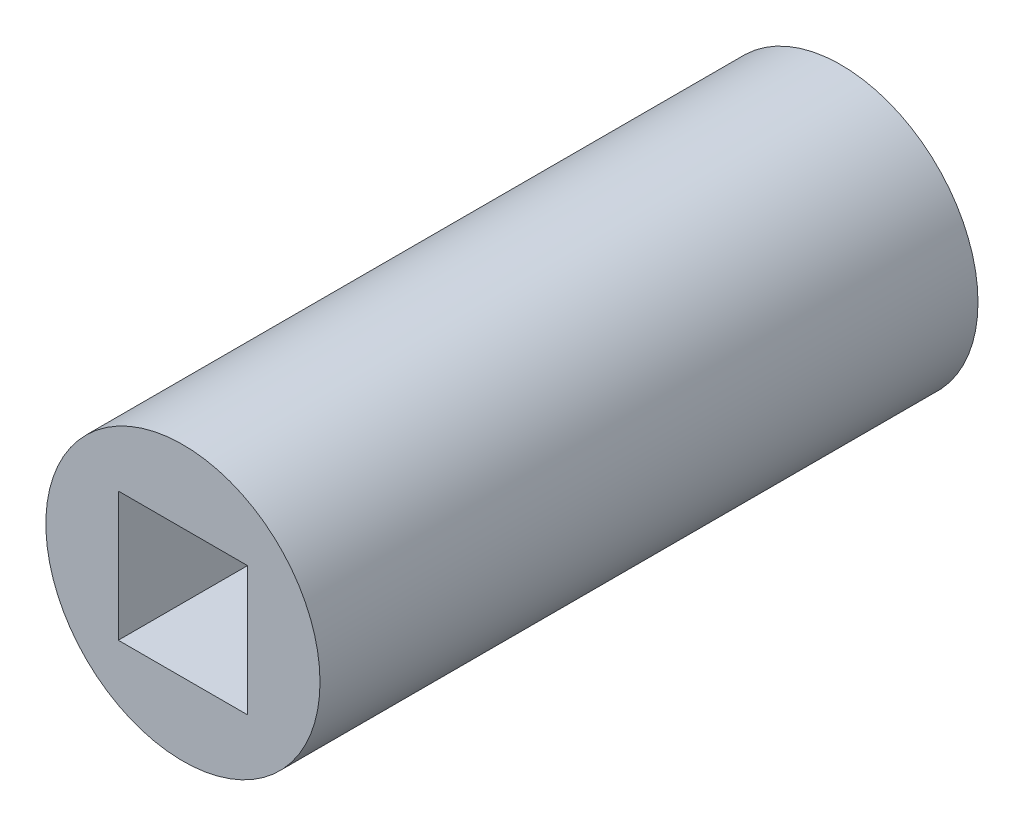
ISO-10303-21;
HEADER;
FILE_DESCRIPTION(('STEP AP214'),'2;1');
FILE_NAME('part.step','',(''),(''),'','','');
FILE_SCHEMA(('AUTOMOTIVE_DESIGN { 1 0 10303 214 1 1 1 1 }'));
ENDSEC;
DATA;
#1=APPLICATION_CONTEXT('core data for automotive mechanical design processes');
#2=APPLICATION_PROTOCOL_DEFINITION('international standard','automotive_design',2000,#1);
#3=PRODUCT_CONTEXT('',#1,'mechanical');
#4=PRODUCT('Part','Part','',(#3));
#5=PRODUCT_RELATED_PRODUCT_CATEGORY('part','',(#4));
#6=PRODUCT_DEFINITION_FORMATION('','',#4);
#7=PRODUCT_DEFINITION_CONTEXT('part definition',#1,'design');
#8=PRODUCT_DEFINITION('design','',#6,#7);
#9=PRODUCT_DEFINITION_SHAPE('','',#8);
#10=(LENGTH_UNIT() NAMED_UNIT(*) SI_UNIT(.MILLI.,.METRE.));
#11=(NAMED_UNIT(*) PLANE_ANGLE_UNIT() SI_UNIT($,.RADIAN.));
#12=(NAMED_UNIT(*) SI_UNIT($,.STERADIAN.) SOLID_ANGLE_UNIT());
#13=UNCERTAINTY_MEASURE_WITH_UNIT(LENGTH_MEASURE(1.E-05),#10,'distance_accuracy_value','');
#14=(GEOMETRIC_REPRESENTATION_CONTEXT(3) GLOBAL_UNCERTAINTY_ASSIGNED_CONTEXT((#13)) GLOBAL_UNIT_ASSIGNED_CONTEXT((#10,
#11,#12)) REPRESENTATION_CONTEXT('',''));
#15=CARTESIAN_POINT('',(0.,0.,0.));
#16=DIRECTION('',(0.,0.,1.));
#17=DIRECTION('',(1.,0.,0.));
#18=AXIS2_PLACEMENT_3D('',#15,#16,#17);
#19=CARTESIAN_POINT('',(0.,0.,8.));
#20=DIRECTION('',(0.,0.,-1.));
#21=DIRECTION('',(-1.,0.,0.));
#22=AXIS2_PLACEMENT_3D('',#19,#20,#21);
#23=PLANE('',#22);
#24=DIRECTION('',(-1.,0.,0.));
#25=VECTOR('',#24,1.);
#26=CARTESIAN_POINT('',(0.,1.05,8.));
#27=LINE('',#26,#25);
#28=CARTESIAN_POINT('',(-1.05,1.05,8.));
#29=VERTEX_POINT('',#28);
#30=CARTESIAN_POINT('',(-1.76776695296637,1.05,8.));
#31=VERTEX_POINT('',#30);
#32=EDGE_CURVE('E220',#29,#31,#27,.T.);
#33=ORIENTED_EDGE('',*,*,#32,.F.);
#34=DIRECTION('',(0.,1.,0.));
#35=VECTOR('',#34,1.);
#36=CARTESIAN_POINT('',(-1.05,0.,8.));
#37=LINE('',#36,#35);
#38=CARTESIAN_POINT('',(-1.05,1.76776695296637,8.));
#39=VERTEX_POINT('',#38);
#40=EDGE_CURVE('E224',#29,#39,#37,.T.);
#41=ORIENTED_EDGE('',*,*,#40,.T.);
#42=DIRECTION('',(-1.,0.,0.));
#43=VECTOR('',#42,1.);
#44=CARTESIAN_POINT('',(-1.76776695296637,1.76776695296637,8.));
#45=LINE('',#44,#43);
#46=CARTESIAN_POINT('',(-1.76776695296637,1.76776695296637,8.));
#47=VERTEX_POINT('',#46);
#48=EDGE_CURVE('E286',#39,#47,#45,.T.);
#49=ORIENTED_EDGE('',*,*,#48,.T.);
#50=DIRECTION('',(0.,-1.,0.));
#51=VECTOR('',#50,1.);
#52=CARTESIAN_POINT('',(-1.76776695296637,-1.76776695296637,8.));
#53=LINE('',#52,#51);
#54=EDGE_CURVE('E292',#47,#31,#53,.T.);
#55=ORIENTED_EDGE('',*,*,#54,.T.);
#56=EDGE_LOOP('',(#33,#41,#49,#55));
#57=FACE_BOUND('',#56,.T.);
#58=ADVANCED_FACE('F33',(#57),#23,.F.);
#59=DIRECTION('',(0.,1.,0.));
#60=VECTOR('',#59,1.);
#61=CARTESIAN_POINT('',(1.05,0.,8.));
#62=LINE('',#61,#60);
#63=CARTESIAN_POINT('',(1.05,-1.76776695296637,8.));
#64=VERTEX_POINT('',#63);
#65=CARTESIAN_POINT('',(1.05,-1.05,8.));
#66=VERTEX_POINT('',#65);
#67=EDGE_CURVE('E201',#64,#66,#62,.T.);
#68=ORIENTED_EDGE('',*,*,#67,.F.);
#69=DIRECTION('',(1.,0.,0.));
#70=VECTOR('',#69,1.);
#71=CARTESIAN_POINT('',(-1.76776695296637,-1.76776695296637,8.));
#72=LINE('',#71,#70);
#73=CARTESIAN_POINT('',(1.76776695296637,-1.76776695296637,8.));
#74=VERTEX_POINT('',#73);
#75=EDGE_CURVE('E295',#64,#74,#72,.T.);
#76=ORIENTED_EDGE('',*,*,#75,.T.);
#77=DIRECTION('',(0.,1.,0.));
#78=VECTOR('',#77,1.);
#79=CARTESIAN_POINT('',(1.76776695296637,-1.76776695296637,8.));
#80=LINE('',#79,#78);
#81=CARTESIAN_POINT('',(1.76776695296637,-1.05,8.));
#82=VERTEX_POINT('',#81);
#83=EDGE_CURVE('E283',#74,#82,#80,.T.);
#84=ORIENTED_EDGE('',*,*,#83,.T.);
#85=DIRECTION('',(-1.,0.,0.));
#86=VECTOR('',#85,1.);
#87=CARTESIAN_POINT('',(0.,-1.05,8.));
#88=LINE('',#87,#86);
#89=EDGE_CURVE('E197',#82,#66,#88,.T.);
#90=ORIENTED_EDGE('',*,*,#89,.T.);
#91=EDGE_LOOP('',(#68,#76,#84,#90));
#92=FACE_BOUND('',#91,.T.);
#93=ADVANCED_FACE('F384',(#92),#23,.F.);
#94=DIRECTION('',(0.,1.,0.));
#95=VECTOR('',#94,1.);
#96=CARTESIAN_POINT('',(1.05,0.,8.));
#97=LINE('',#96,#95);
#98=CARTESIAN_POINT('',(1.05,1.05,8.));
#99=VERTEX_POINT('',#98);
#100=CARTESIAN_POINT('',(1.05,1.76776695296637,8.));
#101=VERTEX_POINT('',#100);
#102=EDGE_CURVE('E179',#99,#101,#97,.T.);
#103=ORIENTED_EDGE('',*,*,#102,.F.);
#104=DIRECTION('',(-1.,0.,0.));
#105=VECTOR('',#104,1.);
#106=CARTESIAN_POINT('',(0.,1.05,8.));
#107=LINE('',#106,#105);
#108=CARTESIAN_POINT('',(1.76776695296637,1.05,8.));
#109=VERTEX_POINT('',#108);
#110=EDGE_CURVE('E171',#109,#99,#107,.T.);
#111=ORIENTED_EDGE('',*,*,#110,.F.);
#112=CARTESIAN_POINT('',(1.76776695296637,1.76776695296637,8.));
#113=VERTEX_POINT('',#112);
#114=EDGE_CURVE('E288',#109,#113,#80,.T.);
#115=ORIENTED_EDGE('',*,*,#114,.T.);
#116=EDGE_CURVE('E190',#113,#101,#45,.T.);
#117=ORIENTED_EDGE('',*,*,#116,.T.);
#118=EDGE_LOOP('',(#103,#111,#115,#117));
#119=FACE_BOUND('',#118,.T.);
#120=ADVANCED_FACE('F188',(#119),#23,.F.);
#121=CARTESIAN_POINT('',(0.,0.,0.));
#122=DIRECTION('',(0.,0.,1.));
#123=DIRECTION('',(1.,0.,0.));
#124=AXIS2_PLACEMENT_3D('',#121,#122,#123);
#125=PLANE('',#124);
#126=CARTESIAN_POINT('',(0.,0.,0.));
#127=DIRECTION('',(0.,0.,1.));
#128=DIRECTION('',(1.,0.,0.));
#129=AXIS2_PLACEMENT_3D('',#126,#127,#128);
#130=CIRCLE('',#129,3.75);
#131=CARTESIAN_POINT('',(3.75,0.,0.));
#132=VERTEX_POINT('',#131);
#133=EDGE_CURVE('E37',#132,#132,#130,.T.);
#134=ORIENTED_EDGE('',*,*,#133,.F.);
#135=EDGE_LOOP('',(#134));
#136=FACE_BOUND('',#135,.T.);
#137=DIRECTION('',(0.,1.,0.));
#138=VECTOR('',#137,1.);
#139=CARTESIAN_POINT('',(1.05,0.,0.));
#140=LINE('',#139,#138);
#141=CARTESIAN_POINT('',(1.05,1.05,0.));
#142=VERTEX_POINT('',#141);
#143=CARTESIAN_POINT('',(1.05,2.5,0.));
#144=VERTEX_POINT('',#143);
#145=EDGE_CURVE('E56',#142,#144,#140,.T.);
#146=ORIENTED_EDGE('',*,*,#145,.T.);
#147=DIRECTION('',(-1.,0.,0.));
#148=VECTOR('',#147,1.);
#149=CARTESIAN_POINT('',(0.,2.5,0.));
#150=LINE('',#149,#148);
#151=CARTESIAN_POINT('',(-1.05,2.5,0.));
#152=VERTEX_POINT('',#151);
#153=EDGE_CURVE('E193',#144,#152,#150,.T.);
#154=ORIENTED_EDGE('',*,*,#153,.T.);
#155=DIRECTION('',(0.,1.,0.));
#156=VECTOR('',#155,1.);
#157=CARTESIAN_POINT('',(-1.05,0.,0.));
#158=LINE('',#157,#156);
#159=CARTESIAN_POINT('',(-1.05,1.05,0.));
#160=VERTEX_POINT('',#159);
#161=EDGE_CURVE('E256',#160,#152,#158,.T.);
#162=ORIENTED_EDGE('',*,*,#161,.F.);
#163=DIRECTION('',(-1.,0.,0.));
#164=VECTOR('',#163,1.);
#165=CARTESIAN_POINT('',(0.,1.05,0.));
#166=LINE('',#165,#164);
#167=CARTESIAN_POINT('',(-2.5,1.05,0.));
#168=VERTEX_POINT('',#167);
#169=EDGE_CURVE('E253',#160,#168,#166,.T.);
#170=ORIENTED_EDGE('',*,*,#169,.T.);
#171=DIRECTION('',(0.,1.,0.));
#172=VECTOR('',#171,1.);
#173=CARTESIAN_POINT('',(-2.5,0.,0.));
#174=LINE('',#173,#172);
#175=CARTESIAN_POINT('',(-2.5,-1.05,0.));
#176=VERTEX_POINT('',#175);
#177=EDGE_CURVE('E250',#176,#168,#174,.T.);
#178=ORIENTED_EDGE('',*,*,#177,.F.);
#179=DIRECTION('',(-1.,0.,0.));
#180=VECTOR('',#179,1.);
#181=CARTESIAN_POINT('',(0.,-1.05,0.));
#182=LINE('',#181,#180);
#183=CARTESIAN_POINT('',(-1.05,-1.05,0.));
#184=VERTEX_POINT('',#183);
#185=EDGE_CURVE('E247',#184,#176,#182,.T.);
#186=ORIENTED_EDGE('',*,*,#185,.F.);
#187=DIRECTION('',(0.,1.,0.));
#188=VECTOR('',#187,1.);
#189=CARTESIAN_POINT('',(-1.05,0.,0.));
#190=LINE('',#189,#188);
#191=CARTESIAN_POINT('',(-1.05,-2.5,0.));
#192=VERTEX_POINT('',#191);
#193=EDGE_CURVE('E244',#192,#184,#190,.T.);
#194=ORIENTED_EDGE('',*,*,#193,.F.);
#195=DIRECTION('',(-1.,0.,0.));
#196=VECTOR('',#195,1.);
#197=CARTESIAN_POINT('',(0.,-2.5,0.));
#198=LINE('',#197,#196);
#199=CARTESIAN_POINT('',(1.05,-2.5,0.));
#200=VERTEX_POINT('',#199);
#201=EDGE_CURVE('E241',#200,#192,#198,.T.);
#202=ORIENTED_EDGE('',*,*,#201,.F.);
#203=DIRECTION('',(0.,1.,0.));
#204=VECTOR('',#203,1.);
#205=CARTESIAN_POINT('',(1.05,0.,0.));
#206=LINE('',#205,#204);
#207=CARTESIAN_POINT('',(1.05,-1.05,0.));
#208=VERTEX_POINT('',#207);
#209=EDGE_CURVE('E238',#200,#208,#206,.T.);
#210=ORIENTED_EDGE('',*,*,#209,.T.);
#211=DIRECTION('',(-1.,0.,0.));
#212=VECTOR('',#211,1.);
#213=CARTESIAN_POINT('',(0.,-1.05,0.));
#214=LINE('',#213,#212);
#215=CARTESIAN_POINT('',(2.5,-1.05,0.));
#216=VERTEX_POINT('',#215);
#217=EDGE_CURVE('E235',#216,#208,#214,.T.);
#218=ORIENTED_EDGE('',*,*,#217,.F.);
#219=DIRECTION('',(0.,1.,0.));
#220=VECTOR('',#219,1.);
#221=CARTESIAN_POINT('',(2.5,0.,0.));
#222=LINE('',#221,#220);
#223=CARTESIAN_POINT('',(2.5,1.05,0.));
#224=VERTEX_POINT('',#223);
#225=EDGE_CURVE('E232',#216,#224,#222,.T.);
#226=ORIENTED_EDGE('',*,*,#225,.T.);
#227=DIRECTION('',(-1.,0.,0.));
#228=VECTOR('',#227,1.);
#229=CARTESIAN_POINT('',(0.,1.05,0.));
#230=LINE('',#229,#228);
#231=EDGE_CURVE('E230',#224,#142,#230,.T.);
#232=ORIENTED_EDGE('',*,*,#231,.T.);
#233=EDGE_LOOP('',(#146,#154,#162,#170,#178,#186,#194,#202,#210,#218,#226,#232));
#234=FACE_BOUND('',#233,.T.);
#235=ADVANCED_FACE('F369',(#136,#234),#125,.F.);
#236=CARTESIAN_POINT('',(0.,0.,18.));
#237=DIRECTION('',(0.,0.,-1.));
#238=DIRECTION('',(-1.,0.,0.));
#239=AXIS2_PLACEMENT_3D('',#236,#237,#238);
#240=CYLINDRICAL_SURFACE('',#239,3.75);
#241=CARTESIAN_POINT('',(0.,0.,18.));
#242=DIRECTION('',(0.,0.,1.));
#243=DIRECTION('',(1.,0.,0.));
#244=AXIS2_PLACEMENT_3D('',#241,#242,#243);
#245=CIRCLE('',#244,3.75);
#246=CARTESIAN_POINT('',(3.75,0.,18.));
#247=VERTEX_POINT('',#246);
#248=EDGE_CURVE('E11',#247,#247,#245,.T.);
#249=ORIENTED_EDGE('',*,*,#248,.F.);
#250=EDGE_LOOP('',(#249));
#251=FACE_BOUND('',#250,.T.);
#252=ORIENTED_EDGE('',*,*,#133,.T.);
#253=EDGE_LOOP('',(#252));
#254=FACE_BOUND('',#253,.T.);
#255=ADVANCED_FACE('F35',(#251,#254),#240,.T.);
#256=CARTESIAN_POINT('',(0.,0.,18.));
#257=DIRECTION('',(0.,0.,1.));
#258=DIRECTION('',(1.,0.,0.));
#259=AXIS2_PLACEMENT_3D('',#256,#257,#258);
#260=PLANE('',#259);
#261=DIRECTION('',(0.,1.,0.));
#262=VECTOR('',#261,1.);
#263=CARTESIAN_POINT('',(1.76776695296637,-1.76776695296637,18.));
#264=LINE('',#263,#262);
#265=CARTESIAN_POINT('',(1.76776695296637,-1.76776695296637,18.));
#266=VERTEX_POINT('',#265);
#267=CARTESIAN_POINT('',(1.76776695296637,1.76776695296637,18.));
#268=VERTEX_POINT('',#267);
#269=EDGE_CURVE('E263',#266,#268,#264,.T.);
#270=ORIENTED_EDGE('',*,*,#269,.F.);
#271=DIRECTION('',(1.,0.,0.));
#272=VECTOR('',#271,1.);
#273=CARTESIAN_POINT('',(-1.76776695296637,-1.76776695296637,18.));
#274=LINE('',#273,#272);
#275=CARTESIAN_POINT('',(-1.76776695296637,-1.76776695296637,18.));
#276=VERTEX_POINT('',#275);
#277=EDGE_CURVE('E309',#276,#266,#274,.T.);
#278=ORIENTED_EDGE('',*,*,#277,.F.);
#279=DIRECTION('',(0.,-1.,0.));
#280=VECTOR('',#279,1.);
#281=CARTESIAN_POINT('',(-1.76776695296637,-1.76776695296637,18.));
#282=LINE('',#281,#280);
#283=CARTESIAN_POINT('',(-1.76776695296637,1.76776695296637,18.));
#284=VERTEX_POINT('',#283);
#285=EDGE_CURVE('E306',#284,#276,#282,.T.);
#286=ORIENTED_EDGE('',*,*,#285,.F.);
#287=DIRECTION('',(-1.,0.,0.));
#288=VECTOR('',#287,1.);
#289=CARTESIAN_POINT('',(-1.76776695296637,1.76776695296637,18.));
#290=LINE('',#289,#288);
#291=EDGE_CURVE('E303',#268,#284,#290,.T.);
#292=ORIENTED_EDGE('',*,*,#291,.F.);
#293=EDGE_LOOP('',(#270,#278,#286,#292));
#294=FACE_BOUND('',#293,.T.);
#295=ORIENTED_EDGE('',*,*,#248,.T.);
#296=EDGE_LOOP('',(#295));
#297=FACE_BOUND('',#296,.T.);
#298=ADVANCED_FACE('F328',(#294,#297),#260,.T.);
#299=CARTESIAN_POINT('',(1.76776695296637,-1.76776695296637,8.));
#300=DIRECTION('',(1.,0.,0.));
#301=DIRECTION('',(0.,0.,-1.));
#302=AXIS2_PLACEMENT_3D('',#299,#300,#301);
#303=PLANE('',#302);
#304=ORIENTED_EDGE('',*,*,#269,.T.);
#305=DIRECTION('',(0.,0.,1.));
#306=VECTOR('',#305,1.);
#307=CARTESIAN_POINT('',(1.76776695296637,1.76776695296637,8.));
#308=LINE('',#307,#306);
#309=EDGE_CURVE('E300',#113,#268,#308,.T.);
#310=ORIENTED_EDGE('',*,*,#309,.F.);
#311=ORIENTED_EDGE('',*,*,#114,.F.);
#312=EDGE_CURVE('E287',#82,#109,#80,.T.);
#313=ORIENTED_EDGE('',*,*,#312,.F.);
#314=ORIENTED_EDGE('',*,*,#83,.F.);
#315=DIRECTION('',(0.,0.,1.));
#316=VECTOR('',#315,1.);
#317=CARTESIAN_POINT('',(1.76776695296637,-1.76776695296637,8.));
#318=LINE('',#317,#316);
#319=EDGE_CURVE('E312',#74,#266,#318,.T.);
#320=ORIENTED_EDGE('',*,*,#319,.T.);
#321=EDGE_LOOP('',(#304,#310,#311,#313,#314,#320));
#322=FACE_BOUND('',#321,.T.);
#323=ADVANCED_FACE('F412',(#322),#303,.F.);
#324=CARTESIAN_POINT('',(-1.76776695296637,-1.76776695296637,8.));
#325=DIRECTION('',(0.,-1.,0.));
#326=DIRECTION('',(0.,0.,-1.));
#327=AXIS2_PLACEMENT_3D('',#324,#325,#326);
#328=PLANE('',#327);
#329=ORIENTED_EDGE('',*,*,#277,.T.);
#330=ORIENTED_EDGE('',*,*,#319,.F.);
#331=ORIENTED_EDGE('',*,*,#75,.F.);
#332=CARTESIAN_POINT('',(-1.05,-1.76776695296637,8.));
#333=VERTEX_POINT('',#332);
#334=EDGE_CURVE('E301',#333,#64,#72,.T.);
#335=ORIENTED_EDGE('',*,*,#334,.F.);
#336=CARTESIAN_POINT('',(-1.76776695296637,-1.76776695296637,8.));
#337=VERTEX_POINT('',#336);
#338=EDGE_CURVE('E297',#337,#333,#72,.T.);
#339=ORIENTED_EDGE('',*,*,#338,.F.);
#340=DIRECTION('',(0.,0.,1.));
#341=VECTOR('',#340,1.);
#342=CARTESIAN_POINT('',(-1.76776695296637,-1.76776695296637,8.));
#343=LINE('',#342,#341);
#344=EDGE_CURVE('E314',#337,#276,#343,.T.);
#345=ORIENTED_EDGE('',*,*,#344,.T.);
#346=EDGE_LOOP('',(#329,#330,#331,#335,#339,#345));
#347=FACE_BOUND('',#346,.T.);
#348=ADVANCED_FACE('F414',(#347),#328,.F.);
#349=CARTESIAN_POINT('',(-1.76776695296637,-1.76776695296637,8.));
#350=DIRECTION('',(-1.,0.,0.));
#351=DIRECTION('',(0.,0.,1.));
#352=AXIS2_PLACEMENT_3D('',#349,#350,#351);
#353=PLANE('',#352);
#354=ORIENTED_EDGE('',*,*,#285,.T.);
#355=ORIENTED_EDGE('',*,*,#344,.F.);
#356=CARTESIAN_POINT('',(-1.76776695296637,-1.05,8.));
#357=VERTEX_POINT('',#356);
#358=EDGE_CURVE('E290',#357,#337,#53,.T.);
#359=ORIENTED_EDGE('',*,*,#358,.F.);
#360=EDGE_CURVE('E296',#31,#357,#53,.T.);
#361=ORIENTED_EDGE('',*,*,#360,.F.);
#362=ORIENTED_EDGE('',*,*,#54,.F.);
#363=DIRECTION('',(0.,0.,1.));
#364=VECTOR('',#363,1.);
#365=CARTESIAN_POINT('',(-1.76776695296637,1.76776695296637,8.));
#366=LINE('',#365,#364);
#367=EDGE_CURVE('E316',#47,#284,#366,.T.);
#368=ORIENTED_EDGE('',*,*,#367,.T.);
#369=EDGE_LOOP('',(#354,#355,#359,#361,#362,#368));
#370=FACE_BOUND('',#369,.T.);
#371=ADVANCED_FACE('F333',(#370),#353,.F.);
#372=CARTESIAN_POINT('',(-1.76776695296637,1.76776695296637,8.));
#373=DIRECTION('',(0.,1.,0.));
#374=DIRECTION('',(0.,0.,1.));
#375=AXIS2_PLACEMENT_3D('',#372,#373,#374);
#376=PLANE('',#375);
#377=ORIENTED_EDGE('',*,*,#291,.T.);
#378=ORIENTED_EDGE('',*,*,#367,.F.);
#379=ORIENTED_EDGE('',*,*,#48,.F.);
#380=EDGE_CURVE('E291',#101,#39,#45,.T.);
#381=ORIENTED_EDGE('',*,*,#380,.F.);
#382=ORIENTED_EDGE('',*,*,#116,.F.);
#383=ORIENTED_EDGE('',*,*,#309,.T.);
#384=EDGE_LOOP('',(#377,#378,#379,#381,#382,#383));
#385=FACE_BOUND('',#384,.T.);
#386=ADVANCED_FACE('F322',(#385),#376,.F.);
#387=DIRECTION('',(0.,1.,0.));
#388=VECTOR('',#387,1.);
#389=CARTESIAN_POINT('',(-1.05,0.,8.));
#390=LINE('',#389,#388);
#391=CARTESIAN_POINT('',(-1.05,-1.05,8.));
#392=VERTEX_POINT('',#391);
#393=EDGE_CURVE('E208',#333,#392,#390,.T.);
#394=ORIENTED_EDGE('',*,*,#393,.T.);
#395=DIRECTION('',(-1.,0.,0.));
#396=VECTOR('',#395,1.);
#397=CARTESIAN_POINT('',(0.,-1.05,8.));
#398=LINE('',#397,#396);
#399=EDGE_CURVE('E213',#392,#357,#398,.T.);
#400=ORIENTED_EDGE('',*,*,#399,.T.);
#401=ORIENTED_EDGE('',*,*,#358,.T.);
#402=ORIENTED_EDGE('',*,*,#338,.T.);
#403=EDGE_LOOP('',(#394,#400,#401,#402));
#404=FACE_BOUND('',#403,.T.);
#405=ADVANCED_FACE('F357',(#404),#23,.F.);
#406=CARTESIAN_POINT('',(0.,0.,8.));
#407=DIRECTION('',(0.,0.,-1.));
#408=DIRECTION('',(-1.,0.,0.));
#409=AXIS2_PLACEMENT_3D('',#406,#407,#408);
#410=PLANE('',#409);
#411=ORIENTED_EDGE('',*,*,#312,.T.);
#412=CARTESIAN_POINT('',(2.5,1.05,8.));
#413=VERTEX_POINT('',#412);
#414=EDGE_CURVE('E48',#413,#109,#107,.T.);
#415=ORIENTED_EDGE('',*,*,#414,.F.);
#416=DIRECTION('',(0.,1.,0.));
#417=VECTOR('',#416,1.);
#418=CARTESIAN_POINT('',(2.5,0.,8.));
#419=LINE('',#418,#417);
#420=CARTESIAN_POINT('',(2.5,-1.05,8.));
#421=VERTEX_POINT('',#420);
#422=EDGE_CURVE('E195',#421,#413,#419,.T.);
#423=ORIENTED_EDGE('',*,*,#422,.F.);
#424=EDGE_CURVE('E198',#421,#82,#88,.T.);
#425=ORIENTED_EDGE('',*,*,#424,.T.);
#426=EDGE_LOOP('',(#411,#415,#423,#425));
#427=FACE_BOUND('',#426,.T.);
#428=ADVANCED_FACE('F392',(#427),#410,.T.);
#429=ORIENTED_EDGE('',*,*,#380,.T.);
#430=CARTESIAN_POINT('',(-1.05,2.5,8.));
#431=VERTEX_POINT('',#430);
#432=EDGE_CURVE('E223',#39,#431,#37,.T.);
#433=ORIENTED_EDGE('',*,*,#432,.T.);
#434=DIRECTION('',(-1.,0.,0.));
#435=VECTOR('',#434,1.);
#436=CARTESIAN_POINT('',(0.,2.5,8.));
#437=LINE('',#436,#435);
#438=CARTESIAN_POINT('',(1.05,2.5,8.));
#439=VERTEX_POINT('',#438);
#440=EDGE_CURVE('E185',#439,#431,#437,.T.);
#441=ORIENTED_EDGE('',*,*,#440,.F.);
#442=EDGE_CURVE('E191',#101,#439,#97,.T.);
#443=ORIENTED_EDGE('',*,*,#442,.F.);
#444=EDGE_LOOP('',(#429,#433,#441,#443));
#445=FACE_BOUND('',#444,.T.);
#446=ADVANCED_FACE('F342',(#445),#410,.T.);
#447=ORIENTED_EDGE('',*,*,#360,.T.);
#448=CARTESIAN_POINT('',(-2.5,-1.05,8.));
#449=VERTEX_POINT('',#448);
#450=EDGE_CURVE('E212',#357,#449,#398,.T.);
#451=ORIENTED_EDGE('',*,*,#450,.T.);
#452=DIRECTION('',(0.,1.,0.));
#453=VECTOR('',#452,1.);
#454=CARTESIAN_POINT('',(-2.5,0.,8.));
#455=LINE('',#454,#453);
#456=CARTESIAN_POINT('',(-2.5,1.05,8.));
#457=VERTEX_POINT('',#456);
#458=EDGE_CURVE('E216',#449,#457,#455,.T.);
#459=ORIENTED_EDGE('',*,*,#458,.T.);
#460=EDGE_CURVE('E219',#31,#457,#27,.T.);
#461=ORIENTED_EDGE('',*,*,#460,.F.);
#462=EDGE_LOOP('',(#447,#451,#459,#461));
#463=FACE_BOUND('',#462,.T.);
#464=ADVANCED_FACE('F363',(#463),#410,.T.);
#465=ORIENTED_EDGE('',*,*,#334,.T.);
#466=CARTESIAN_POINT('',(1.05,-2.5,8.));
#467=VERTEX_POINT('',#466);
#468=EDGE_CURVE('E202',#467,#64,#62,.T.);
#469=ORIENTED_EDGE('',*,*,#468,.F.);
#470=DIRECTION('',(-1.,0.,0.));
#471=VECTOR('',#470,1.);
#472=CARTESIAN_POINT('',(0.,-2.5,8.));
#473=LINE('',#472,#471);
#474=CARTESIAN_POINT('',(-1.05,-2.5,8.));
#475=VERTEX_POINT('',#474);
#476=EDGE_CURVE('E205',#467,#475,#473,.T.);
#477=ORIENTED_EDGE('',*,*,#476,.T.);
#478=EDGE_CURVE('E209',#475,#333,#390,.T.);
#479=ORIENTED_EDGE('',*,*,#478,.T.);
#480=EDGE_LOOP('',(#465,#469,#477,#479));
#481=FACE_BOUND('',#480,.T.);
#482=ADVANCED_FACE('F380',(#481),#410,.T.);
#483=CARTESIAN_POINT('',(1.05,0.,8.));
#484=DIRECTION('',(-1.,0.,0.));
#485=DIRECTION('',(0.,0.,1.));
#486=AXIS2_PLACEMENT_3D('',#483,#484,#485);
#487=PLANE('',#486);
#488=ORIENTED_EDGE('',*,*,#145,.F.);
#489=DIRECTION('',(0.,0.,-1.));
#490=VECTOR('',#489,1.);
#491=CARTESIAN_POINT('',(1.05,1.05,8.));
#492=LINE('',#491,#490);
#493=EDGE_CURVE('E174',#99,#142,#492,.T.);
#494=ORIENTED_EDGE('',*,*,#493,.F.);
#495=ORIENTED_EDGE('',*,*,#102,.T.);
#496=ORIENTED_EDGE('',*,*,#442,.T.);
#497=DIRECTION('',(0.,0.,-1.));
#498=VECTOR('',#497,1.);
#499=CARTESIAN_POINT('',(1.05,2.5,8.));
#500=LINE('',#499,#498);
#501=EDGE_CURVE('E261',#439,#144,#500,.T.);
#502=ORIENTED_EDGE('',*,*,#501,.T.);
#503=EDGE_LOOP('',(#488,#494,#495,#496,#502));
#504=FACE_BOUND('',#503,.T.);
#505=ADVANCED_FACE('F182',(#504),#487,.T.);
#506=CARTESIAN_POINT('',(0.,2.5,8.));
#507=DIRECTION('',(0.,-1.,0.));
#508=DIRECTION('',(0.,0.,-1.));
#509=AXIS2_PLACEMENT_3D('',#506,#507,#508);
#510=PLANE('',#509);
#511=ORIENTED_EDGE('',*,*,#153,.F.);
#512=ORIENTED_EDGE('',*,*,#501,.F.);
#513=ORIENTED_EDGE('',*,*,#440,.T.);
#514=DIRECTION('',(0.,0.,-1.));
#515=VECTOR('',#514,1.);
#516=CARTESIAN_POINT('',(-1.05,2.5,8.));
#517=LINE('',#516,#515);
#518=EDGE_CURVE('E264',#431,#152,#517,.T.);
#519=ORIENTED_EDGE('',*,*,#518,.T.);
#520=EDGE_LOOP('',(#511,#512,#513,#519));
#521=FACE_BOUND('',#520,.T.);
#522=ADVANCED_FACE('F372',(#521),#510,.T.);
#523=CARTESIAN_POINT('',(-1.05,0.,8.));
#524=DIRECTION('',(-1.,0.,0.));
#525=DIRECTION('',(0.,0.,1.));
#526=AXIS2_PLACEMENT_3D('',#523,#524,#525);
#527=PLANE('',#526);
#528=ORIENTED_EDGE('',*,*,#161,.T.);
#529=ORIENTED_EDGE('',*,*,#518,.F.);
#530=ORIENTED_EDGE('',*,*,#432,.F.);
#531=ORIENTED_EDGE('',*,*,#40,.F.);
#532=DIRECTION('',(0.,0.,-1.));
#533=VECTOR('',#532,1.);
#534=CARTESIAN_POINT('',(-1.05,1.05,8.));
#535=LINE('',#534,#533);
#536=EDGE_CURVE('E266',#29,#160,#535,.T.);
#537=ORIENTED_EDGE('',*,*,#536,.T.);
#538=EDGE_LOOP('',(#528,#529,#530,#531,#537));
#539=FACE_BOUND('',#538,.T.);
#540=ADVANCED_FACE('F347',(#539),#527,.F.);
#541=CARTESIAN_POINT('',(0.,1.05,8.));
#542=DIRECTION('',(0.,-1.,0.));
#543=DIRECTION('',(0.,0.,-1.));
#544=AXIS2_PLACEMENT_3D('',#541,#542,#543);
#545=PLANE('',#544);
#546=ORIENTED_EDGE('',*,*,#169,.F.);
#547=ORIENTED_EDGE('',*,*,#536,.F.);
#548=ORIENTED_EDGE('',*,*,#32,.T.);
#549=ORIENTED_EDGE('',*,*,#460,.T.);
#550=DIRECTION('',(0.,0.,-1.));
#551=VECTOR('',#550,1.);
#552=CARTESIAN_POINT('',(-2.5,1.05,8.));
#553=LINE('',#552,#551);
#554=EDGE_CURVE('E268',#457,#168,#553,.T.);
#555=ORIENTED_EDGE('',*,*,#554,.T.);
#556=EDGE_LOOP('',(#546,#547,#548,#549,#555));
#557=FACE_BOUND('',#556,.T.);
#558=ADVANCED_FACE('F351',(#557),#545,.T.);
#559=CARTESIAN_POINT('',(-2.5,0.,8.));
#560=DIRECTION('',(-1.,0.,0.));
#561=DIRECTION('',(0.,0.,1.));
#562=AXIS2_PLACEMENT_3D('',#559,#560,#561);
#563=PLANE('',#562);
#564=ORIENTED_EDGE('',*,*,#177,.T.);
#565=ORIENTED_EDGE('',*,*,#554,.F.);
#566=ORIENTED_EDGE('',*,*,#458,.F.);
#567=DIRECTION('',(0.,0.,-1.));
#568=VECTOR('',#567,1.);
#569=CARTESIAN_POINT('',(-2.5,-1.05,8.));
#570=LINE('',#569,#568);
#571=EDGE_CURVE('E270',#449,#176,#570,.T.);
#572=ORIENTED_EDGE('',*,*,#571,.T.);
#573=EDGE_LOOP('',(#564,#565,#566,#572));
#574=FACE_BOUND('',#573,.T.);
#575=ADVANCED_FACE('F365',(#574),#563,.F.);
#576=CARTESIAN_POINT('',(0.,-1.05,8.));
#577=DIRECTION('',(0.,-1.,0.));
#578=DIRECTION('',(0.,0.,-1.));
#579=AXIS2_PLACEMENT_3D('',#576,#577,#578);
#580=PLANE('',#579);
#581=ORIENTED_EDGE('',*,*,#185,.T.);
#582=ORIENTED_EDGE('',*,*,#571,.F.);
#583=ORIENTED_EDGE('',*,*,#450,.F.);
#584=ORIENTED_EDGE('',*,*,#399,.F.);
#585=DIRECTION('',(0.,0.,-1.));
#586=VECTOR('',#585,1.);
#587=CARTESIAN_POINT('',(-1.05,-1.05,8.));
#588=LINE('',#587,#586);
#589=EDGE_CURVE('E272',#392,#184,#588,.T.);
#590=ORIENTED_EDGE('',*,*,#589,.T.);
#591=EDGE_LOOP('',(#581,#582,#583,#584,#590));
#592=FACE_BOUND('',#591,.T.);
#593=ADVANCED_FACE('F360',(#592),#580,.F.);
#594=CARTESIAN_POINT('',(-1.05,0.,8.));
#595=DIRECTION('',(-1.,0.,0.));
#596=DIRECTION('',(0.,0.,1.));
#597=AXIS2_PLACEMENT_3D('',#594,#595,#596);
#598=PLANE('',#597);
#599=ORIENTED_EDGE('',*,*,#193,.T.);
#600=ORIENTED_EDGE('',*,*,#589,.F.);
#601=ORIENTED_EDGE('',*,*,#393,.F.);
#602=ORIENTED_EDGE('',*,*,#478,.F.);
#603=DIRECTION('',(0.,0.,-1.));
#604=VECTOR('',#603,1.);
#605=CARTESIAN_POINT('',(-1.05,-2.5,8.));
#606=LINE('',#605,#604);
#607=EDGE_CURVE('E274',#475,#192,#606,.T.);
#608=ORIENTED_EDGE('',*,*,#607,.T.);
#609=EDGE_LOOP('',(#599,#600,#601,#602,#608));
#610=FACE_BOUND('',#609,.T.);
#611=ADVANCED_FACE('F445',(#610),#598,.F.);
#612=CARTESIAN_POINT('',(0.,-2.5,8.));
#613=DIRECTION('',(0.,-1.,0.));
#614=DIRECTION('',(0.,0.,-1.));
#615=AXIS2_PLACEMENT_3D('',#612,#613,#614);
#616=PLANE('',#615);
#617=ORIENTED_EDGE('',*,*,#201,.T.);
#618=ORIENTED_EDGE('',*,*,#607,.F.);
#619=ORIENTED_EDGE('',*,*,#476,.F.);
#620=DIRECTION('',(0.,0.,-1.));
#621=VECTOR('',#620,1.);
#622=CARTESIAN_POINT('',(1.05,-2.5,8.));
#623=LINE('',#622,#621);
#624=EDGE_CURVE('E276',#467,#200,#623,.T.);
#625=ORIENTED_EDGE('',*,*,#624,.T.);
#626=EDGE_LOOP('',(#617,#618,#619,#625));
#627=FACE_BOUND('',#626,.T.);
#628=ADVANCED_FACE('F442',(#627),#616,.F.);
#629=CARTESIAN_POINT('',(1.05,0.,8.));
#630=DIRECTION('',(-1.,0.,0.));
#631=DIRECTION('',(0.,0.,1.));
#632=AXIS2_PLACEMENT_3D('',#629,#630,#631);
#633=PLANE('',#632);
#634=ORIENTED_EDGE('',*,*,#209,.F.);
#635=ORIENTED_EDGE('',*,*,#624,.F.);
#636=ORIENTED_EDGE('',*,*,#468,.T.);
#637=ORIENTED_EDGE('',*,*,#67,.T.);
#638=DIRECTION('',(0.,0.,-1.));
#639=VECTOR('',#638,1.);
#640=CARTESIAN_POINT('',(1.05,-1.05,8.));
#641=LINE('',#640,#639);
#642=EDGE_CURVE('E278',#66,#208,#641,.T.);
#643=ORIENTED_EDGE('',*,*,#642,.T.);
#644=EDGE_LOOP('',(#634,#635,#636,#637,#643));
#645=FACE_BOUND('',#644,.T.);
#646=ADVANCED_FACE('F432',(#645),#633,.T.);
#647=CARTESIAN_POINT('',(0.,-1.05,8.));
#648=DIRECTION('',(0.,-1.,0.));
#649=DIRECTION('',(0.,0.,-1.));
#650=AXIS2_PLACEMENT_3D('',#647,#648,#649);
#651=PLANE('',#650);
#652=ORIENTED_EDGE('',*,*,#217,.T.);
#653=ORIENTED_EDGE('',*,*,#642,.F.);
#654=ORIENTED_EDGE('',*,*,#89,.F.);
#655=ORIENTED_EDGE('',*,*,#424,.F.);
#656=DIRECTION('',(0.,0.,-1.));
#657=VECTOR('',#656,1.);
#658=CARTESIAN_POINT('',(2.5,-1.05,8.));
#659=LINE('',#658,#657);
#660=EDGE_CURVE('E280',#421,#216,#659,.T.);
#661=ORIENTED_EDGE('',*,*,#660,.T.);
#662=EDGE_LOOP('',(#652,#653,#654,#655,#661));
#663=FACE_BOUND('',#662,.T.);
#664=ADVANCED_FACE('F434',(#663),#651,.F.);
#665=CARTESIAN_POINT('',(2.5,0.,8.));
#666=DIRECTION('',(-1.,0.,0.));
#667=DIRECTION('',(0.,0.,1.));
#668=AXIS2_PLACEMENT_3D('',#665,#666,#667);
#669=PLANE('',#668);
#670=ORIENTED_EDGE('',*,*,#225,.F.);
#671=ORIENTED_EDGE('',*,*,#660,.F.);
#672=ORIENTED_EDGE('',*,*,#422,.T.);
#673=DIRECTION('',(0.,0.,-1.));
#674=VECTOR('',#673,1.);
#675=CARTESIAN_POINT('',(2.5,1.05,8.));
#676=LINE('',#675,#674);
#677=EDGE_CURVE('E184',#413,#224,#676,.T.);
#678=ORIENTED_EDGE('',*,*,#677,.T.);
#679=EDGE_LOOP('',(#670,#671,#672,#678));
#680=FACE_BOUND('',#679,.T.);
#681=ADVANCED_FACE('F461',(#680),#669,.T.);
#682=CARTESIAN_POINT('',(0.,1.05,8.));
#683=DIRECTION('',(0.,-1.,0.));
#684=DIRECTION('',(0.,0.,-1.));
#685=AXIS2_PLACEMENT_3D('',#682,#683,#684);
#686=PLANE('',#685);
#687=ORIENTED_EDGE('',*,*,#231,.F.);
#688=ORIENTED_EDGE('',*,*,#677,.F.);
#689=ORIENTED_EDGE('',*,*,#414,.T.);
#690=ORIENTED_EDGE('',*,*,#110,.T.);
#691=ORIENTED_EDGE('',*,*,#493,.T.);
#692=EDGE_LOOP('',(#687,#688,#689,#690,#691));
#693=FACE_BOUND('',#692,.T.);
#694=ADVANCED_FACE('F173',(#693),#686,.T.);
#695=CLOSED_SHELL('',(#58,#93,#120,#235,#255,#298,#323,#348,#371,#386,#405,#428,#446,#464,#482,
#505,#522,#540,#558,#575,#593,#611,#628,#646,#664,#681,#694));
#696=MANIFOLD_SOLID_BREP('B2',#695);
#697=ADVANCED_BREP_SHAPE_REPRESENTATION('',(#18,#696),#14);
#698=SHAPE_DEFINITION_REPRESENTATION(#9,#697);
ENDSEC;
END-ISO-10303-21;
